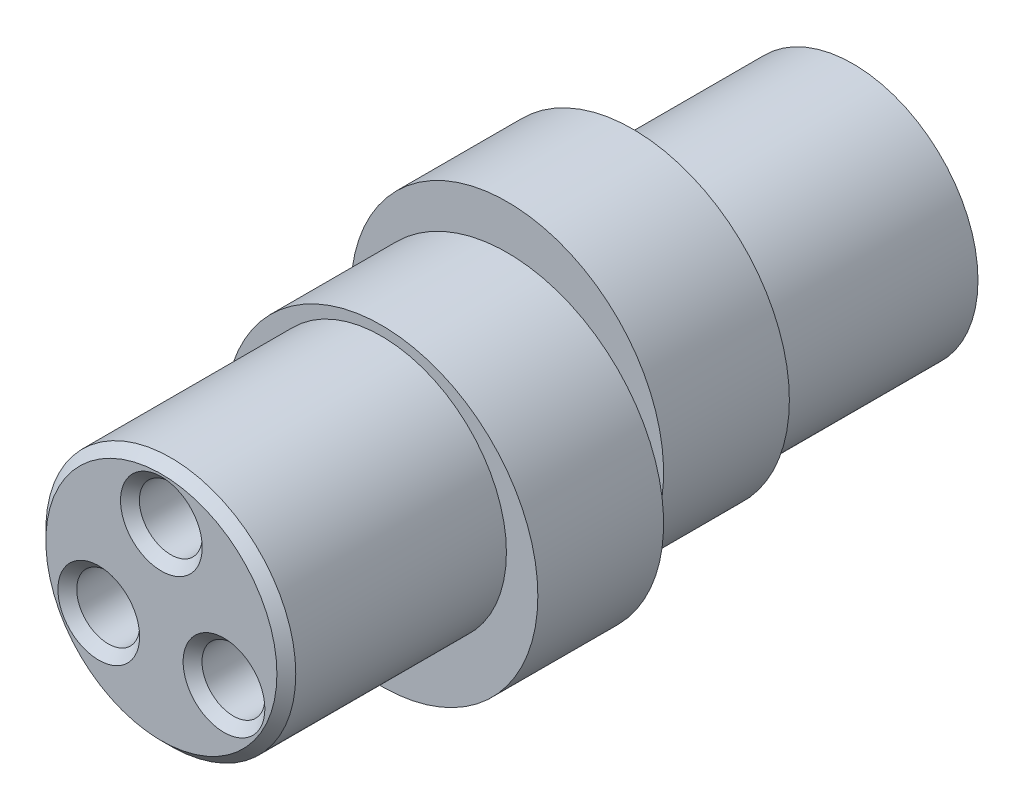
ISO-10303-21;
HEADER;
FILE_DESCRIPTION(('STEP AP214'),'2;1');
FILE_NAME('part.step','',(''),(''),'','','');
FILE_SCHEMA(('AUTOMOTIVE_DESIGN { 1 0 10303 214 1 1 1 1 }'));
ENDSEC;
DATA;
#1=APPLICATION_CONTEXT('core data for automotive mechanical design processes');
#2=APPLICATION_PROTOCOL_DEFINITION('international standard','automotive_design',2000,#1);
#3=PRODUCT_CONTEXT('',#1,'mechanical');
#4=PRODUCT('Part','Part','',(#3));
#5=PRODUCT_RELATED_PRODUCT_CATEGORY('part','',(#4));
#6=PRODUCT_DEFINITION_FORMATION('','',#4);
#7=PRODUCT_DEFINITION_CONTEXT('part definition',#1,'design');
#8=PRODUCT_DEFINITION('design','',#6,#7);
#9=PRODUCT_DEFINITION_SHAPE('','',#8);
#10=(LENGTH_UNIT() NAMED_UNIT(*) SI_UNIT(.MILLI.,.METRE.));
#11=(NAMED_UNIT(*) PLANE_ANGLE_UNIT() SI_UNIT($,.RADIAN.));
#12=(NAMED_UNIT(*) SI_UNIT($,.STERADIAN.) SOLID_ANGLE_UNIT());
#13=UNCERTAINTY_MEASURE_WITH_UNIT(LENGTH_MEASURE(1.E-05),#10,'distance_accuracy_value','');
#14=(GEOMETRIC_REPRESENTATION_CONTEXT(3) GLOBAL_UNCERTAINTY_ASSIGNED_CONTEXT((#13)) GLOBAL_UNIT_ASSIGNED_CONTEXT((#10,
#11,#12)) REPRESENTATION_CONTEXT('',''));
#15=CARTESIAN_POINT('',(0.,0.,0.));
#16=DIRECTION('',(0.,0.,1.));
#17=DIRECTION('',(1.,0.,0.));
#18=AXIS2_PLACEMENT_3D('',#15,#16,#17);
#19=CARTESIAN_POINT('',(0.,0.7,4.));
#20=DIRECTION('',(0.,0.,-1.));
#21=DIRECTION('',(-1.,0.,0.));
#22=AXIS2_PLACEMENT_3D('',#19,#20,#21);
#23=CYLINDRICAL_SURFACE('',#22,4.975);
#24=CARTESIAN_POINT('',(0.,0.7,4.));
#25=DIRECTION('',(0.,0.,1.));
#26=DIRECTION('',(1.,0.,0.));
#27=AXIS2_PLACEMENT_3D('',#24,#25,#26);
#28=CIRCLE('',#27,4.975);
#29=CARTESIAN_POINT('',(-4.92550758805628,0.,4.));
#30=VERTEX_POINT('',#29);
#31=CARTESIAN_POINT('',(4.92550758805628,0.,4.));
#32=VERTEX_POINT('',#31);
#33=EDGE_CURVE('E70',#30,#32,#28,.T.);
#34=ORIENTED_EDGE('',*,*,#33,.F.);
#35=EDGE_CURVE('E72',#32,#30,#28,.T.);
#36=ORIENTED_EDGE('',*,*,#35,.F.);
#37=EDGE_LOOP('',(#34,#36));
#38=FACE_BOUND('',#37,.T.);
#39=CARTESIAN_POINT('',(0.,0.7,0.));
#40=DIRECTION('',(0.,0.,1.));
#41=DIRECTION('',(1.,0.,0.));
#42=AXIS2_PLACEMENT_3D('',#39,#40,#41);
#43=CIRCLE('',#42,4.975);
#44=CARTESIAN_POINT('',(4.975,0.7,0.));
#45=VERTEX_POINT('',#44);
#46=EDGE_CURVE('E81',#45,#45,#43,.T.);
#47=ORIENTED_EDGE('',*,*,#46,.T.);
#48=EDGE_LOOP('',(#47));
#49=FACE_BOUND('',#48,.T.);
#50=ADVANCED_FACE('F49',(#38,#49),#23,.T.);
#51=CARTESIAN_POINT('',(0.,0.,4.));
#52=DIRECTION('',(0.,0.,1.));
#53=DIRECTION('',(1.,0.,0.));
#54=AXIS2_PLACEMENT_3D('',#51,#52,#53);
#55=PLANE('',#54);
#56=CARTESIAN_POINT('',(0.,-0.7,4.));
#57=DIRECTION('',(0.,0.,1.));
#58=DIRECTION('',(1.,0.,0.));
#59=AXIS2_PLACEMENT_3D('',#56,#57,#58);
#60=CIRCLE('',#59,4.975);
#61=EDGE_CURVE('E65',#32,#30,#60,.T.);
#62=ORIENTED_EDGE('',*,*,#61,.F.);
#63=ORIENTED_EDGE('',*,*,#35,.T.);
#64=EDGE_LOOP('',(#62,#63));
#65=FACE_BOUND('',#64,.T.);
#66=ADVANCED_FACE('F79',(#65),#55,.T.);
#67=CARTESIAN_POINT('',(0.,0.,0.));
#68=DIRECTION('',(0.,0.,1.));
#69=DIRECTION('',(1.,0.,0.));
#70=AXIS2_PLACEMENT_3D('',#67,#68,#69);
#71=PLANE('',#70);
#72=CARTESIAN_POINT('',(0.,0.,0.));
#73=DIRECTION('',(0.,0.,1.));
#74=DIRECTION('',(1.,0.,0.));
#75=AXIS2_PLACEMENT_3D('',#72,#73,#74);
#76=CIRCLE('',#75,3.975);
#77=CARTESIAN_POINT('',(3.975,0.,0.));
#78=VERTEX_POINT('',#77);
#79=EDGE_CURVE('E77',#78,#78,#76,.F.);
#80=ORIENTED_EDGE('',*,*,#79,.F.);
#81=EDGE_LOOP('',(#80));
#82=FACE_BOUND('',#81,.T.);
#83=ORIENTED_EDGE('',*,*,#46,.F.);
#84=EDGE_LOOP('',(#83));
#85=FACE_BOUND('',#84,.T.);
#86=ADVANCED_FACE('F152',(#82,#85),#71,.F.);
#87=CARTESIAN_POINT('',(0.,-0.7,4.));
#88=DIRECTION('',(0.,0.,1.));
#89=DIRECTION('',(1.,0.,0.));
#90=AXIS2_PLACEMENT_3D('',#87,#88,#89);
#91=PLANE('',#90);
#92=EDGE_CURVE('E82',#30,#32,#60,.T.);
#93=ORIENTED_EDGE('',*,*,#92,.F.);
#94=ORIENTED_EDGE('',*,*,#33,.T.);
#95=EDGE_LOOP('',(#93,#94));
#96=FACE_BOUND('',#95,.T.);
#97=ADVANCED_FACE('F83',(#96),#91,.F.);
#98=CARTESIAN_POINT('',(0.,-0.7,8.));
#99=DIRECTION('',(0.,0.,-1.));
#100=DIRECTION('',(-1.,0.,0.));
#101=AXIS2_PLACEMENT_3D('',#98,#99,#100);
#102=CYLINDRICAL_SURFACE('',#101,4.975);
#103=CARTESIAN_POINT('',(0.,-0.7,8.));
#104=DIRECTION('',(0.,0.,1.));
#105=DIRECTION('',(1.,0.,0.));
#106=AXIS2_PLACEMENT_3D('',#103,#104,#105);
#107=CIRCLE('',#106,4.975);
#108=CARTESIAN_POINT('',(4.975,-0.7,8.));
#109=VERTEX_POINT('',#108);
#110=EDGE_CURVE('E90',#109,#109,#107,.T.);
#111=ORIENTED_EDGE('',*,*,#110,.F.);
#112=EDGE_LOOP('',(#111));
#113=FACE_BOUND('',#112,.T.);
#114=ORIENTED_EDGE('',*,*,#61,.T.);
#115=ORIENTED_EDGE('',*,*,#92,.T.);
#116=EDGE_LOOP('',(#114,#115));
#117=FACE_BOUND('',#116,.T.);
#118=ADVANCED_FACE('F88',(#113,#117),#102,.T.);
#119=CARTESIAN_POINT('',(0.,-0.7,8.));
#120=DIRECTION('',(0.,0.,1.));
#121=DIRECTION('',(1.,0.,0.));
#122=AXIS2_PLACEMENT_3D('',#119,#120,#121);
#123=PLANE('',#122);
#124=CARTESIAN_POINT('',(0.,0.,8.));
#125=DIRECTION('',(0.,0.,1.));
#126=DIRECTION('',(1.,0.,0.));
#127=AXIS2_PLACEMENT_3D('',#124,#125,#126);
#128=CIRCLE('',#127,3.975);
#129=CARTESIAN_POINT('',(3.975,0.,8.));
#130=VERTEX_POINT('',#129);
#131=EDGE_CURVE('E86',#130,#130,#128,.F.);
#132=ORIENTED_EDGE('',*,*,#131,.T.);
#133=EDGE_LOOP('',(#132));
#134=FACE_BOUND('',#133,.T.);
#135=ORIENTED_EDGE('',*,*,#110,.T.);
#136=EDGE_LOOP('',(#135));
#137=FACE_BOUND('',#136,.T.);
#138=ADVANCED_FACE('F182',(#134,#137),#123,.T.);
#139=CARTESIAN_POINT('',(0.,0.,15.));
#140=DIRECTION('',(0.,0.,1.));
#141=DIRECTION('',(1.,0.,0.));
#142=AXIS2_PLACEMENT_3D('',#139,#140,#141);
#143=PLANE('',#142);
#144=CARTESIAN_POINT('',(0.,0.,15.));
#145=DIRECTION('',(0.,0.,1.));
#146=DIRECTION('',(1.,0.,0.));
#147=AXIS2_PLACEMENT_3D('',#144,#145,#146);
#148=CIRCLE('',#147,3.675);
#149=CARTESIAN_POINT('',(3.675,0.,15.));
#150=VERTEX_POINT('',#149);
#151=EDGE_CURVE('E115',#150,#150,#148,.T.);
#152=ORIENTED_EDGE('',*,*,#151,.T.);
#153=EDGE_LOOP('',(#152));
#154=FACE_BOUND('',#153,.T.);
#155=CARTESIAN_POINT('',(1.9918584287043,-1.14999999999994,15.));
#156=DIRECTION('',(0.,0.,1.));
#157=DIRECTION('',(1.,0.,0.));
#158=AXIS2_PLACEMENT_3D('',#155,#156,#157);
#159=CIRCLE('',#158,1.3);
#160=CARTESIAN_POINT('',(3.2918584287043,-1.14999999999994,15.));
#161=VERTEX_POINT('',#160);
#162=EDGE_CURVE('E111',#161,#161,#159,.F.);
#163=ORIENTED_EDGE('',*,*,#162,.T.);
#164=EDGE_LOOP('',(#163));
#165=FACE_BOUND('',#164,.T.);
#166=CARTESIAN_POINT('',(-1.99185842870411,-1.15000000000006,15.));
#167=DIRECTION('',(0.,0.,1.));
#168=DIRECTION('',(1.,0.,0.));
#169=AXIS2_PLACEMENT_3D('',#166,#167,#168);
#170=CIRCLE('',#169,1.3);
#171=CARTESIAN_POINT('',(-0.691858428704114,-1.15000000000006,15.));
#172=VERTEX_POINT('',#171);
#173=EDGE_CURVE('E107',#172,#172,#170,.F.);
#174=ORIENTED_EDGE('',*,*,#173,.T.);
#175=EDGE_LOOP('',(#174));
#176=FACE_BOUND('',#175,.T.);
#177=CARTESIAN_POINT('',(0.,2.3,15.));
#178=DIRECTION('',(0.,0.,1.));
#179=DIRECTION('',(1.,0.,0.));
#180=AXIS2_PLACEMENT_3D('',#177,#178,#179);
#181=CIRCLE('',#180,1.3);
#182=CARTESIAN_POINT('',(1.3,2.3,15.));
#183=VERTEX_POINT('',#182);
#184=EDGE_CURVE('E103',#183,#183,#181,.F.);
#185=ORIENTED_EDGE('',*,*,#184,.T.);
#186=EDGE_LOOP('',(#185));
#187=FACE_BOUND('',#186,.T.);
#188=ADVANCED_FACE('F178',(#154,#165,#176,#187),#143,.T.);
#189=CARTESIAN_POINT('',(0.,0.,15.));
#190=DIRECTION('',(0.,0.,-1.));
#191=DIRECTION('',(-1.,0.,0.));
#192=AXIS2_PLACEMENT_3D('',#189,#190,#191);
#193=CYLINDRICAL_SURFACE('',#192,3.975);
#194=CARTESIAN_POINT('',(0.,0.,14.7));
#195=DIRECTION('',(0.,0.,1.));
#196=DIRECTION('',(1.,0.,0.));
#197=AXIS2_PLACEMENT_3D('',#194,#195,#196);
#198=CIRCLE('',#197,3.975);
#199=CARTESIAN_POINT('',(3.975,0.,14.7));
#200=VERTEX_POINT('',#199);
#201=EDGE_CURVE('E119',#200,#200,#198,.F.);
#202=ORIENTED_EDGE('',*,*,#201,.T.);
#203=EDGE_LOOP('',(#202));
#204=FACE_BOUND('',#203,.T.);
#205=ORIENTED_EDGE('',*,*,#131,.F.);
#206=EDGE_LOOP('',(#205));
#207=FACE_BOUND('',#206,.T.);
#208=ADVANCED_FACE('F181',(#204,#207),#193,.T.);
#209=CARTESIAN_POINT('',(0.,0.,-7.));
#210=DIRECTION('',(0.,0.,1.));
#211=DIRECTION('',(1.,0.,0.));
#212=AXIS2_PLACEMENT_3D('',#209,#210,#211);
#213=CIRCLE('',#212,3.975);
#214=CARTESIAN_POINT('',(3.975,0.,-7.));
#215=VERTEX_POINT('',#214);
#216=EDGE_CURVE('E102',#215,#215,#213,.T.);
#217=ORIENTED_EDGE('',*,*,#216,.T.);
#218=EDGE_LOOP('',(#217));
#219=FACE_BOUND('',#218,.T.);
#220=ORIENTED_EDGE('',*,*,#79,.T.);
#221=EDGE_LOOP('',(#220));
#222=FACE_BOUND('',#221,.T.);
#223=ADVANCED_FACE('F212',(#219,#222),#193,.T.);
#224=CARTESIAN_POINT('',(0.,0.,-7.));
#225=DIRECTION('',(0.,0.,1.));
#226=DIRECTION('',(1.,0.,0.));
#227=AXIS2_PLACEMENT_3D('',#224,#225,#226);
#228=PLANE('',#227);
#229=CARTESIAN_POINT('',(0.,2.3,-7.));
#230=DIRECTION('',(0.,0.,1.));
#231=DIRECTION('',(1.,0.,0.));
#232=AXIS2_PLACEMENT_3D('',#229,#230,#231);
#233=CIRCLE('',#232,1.);
#234=CARTESIAN_POINT('',(1.,2.3,-7.));
#235=VERTEX_POINT('',#234);
#236=EDGE_CURVE('E193',#235,#235,#233,.T.);
#237=ORIENTED_EDGE('',*,*,#236,.T.);
#238=EDGE_LOOP('',(#237));
#239=FACE_BOUND('',#238,.T.);
#240=CARTESIAN_POINT('',(-1.99185842870411,-1.15000000000006,-7.));
#241=DIRECTION('',(0.,0.,1.));
#242=DIRECTION('',(1.,0.,0.));
#243=AXIS2_PLACEMENT_3D('',#240,#241,#242);
#244=CIRCLE('',#243,1.);
#245=CARTESIAN_POINT('',(-0.991858428704113,-1.15000000000006,-7.));
#246=VERTEX_POINT('',#245);
#247=EDGE_CURVE('E196',#246,#246,#244,.T.);
#248=ORIENTED_EDGE('',*,*,#247,.T.);
#249=EDGE_LOOP('',(#248));
#250=FACE_BOUND('',#249,.T.);
#251=CARTESIAN_POINT('',(1.9918584287043,-1.14999999999994,-7.));
#252=DIRECTION('',(0.,0.,1.));
#253=DIRECTION('',(1.,0.,0.));
#254=AXIS2_PLACEMENT_3D('',#251,#252,#253);
#255=CIRCLE('',#254,1.);
#256=CARTESIAN_POINT('',(2.9918584287043,-1.14999999999994,-7.));
#257=VERTEX_POINT('',#256);
#258=EDGE_CURVE('E203',#257,#257,#255,.T.);
#259=ORIENTED_EDGE('',*,*,#258,.T.);
#260=EDGE_LOOP('',(#259));
#261=FACE_BOUND('',#260,.T.);
#262=ORIENTED_EDGE('',*,*,#216,.F.);
#263=EDGE_LOOP('',(#262));
#264=FACE_BOUND('',#263,.T.);
#265=ADVANCED_FACE('F233',(#239,#250,#261,#264),#228,.F.);
#266=CARTESIAN_POINT('',(1.9918584287043,-1.14999999999994,-7.));
#267=DIRECTION('',(0.,0.,1.));
#268=DIRECTION('',(1.,0.,0.));
#269=AXIS2_PLACEMENT_3D('',#266,#267,#268);
#270=CYLINDRICAL_SURFACE('',#269,1.);
#271=CARTESIAN_POINT('',(1.9918584287043,-1.14999999999994,14.7));
#272=DIRECTION('',(0.,0.,1.));
#273=DIRECTION('',(1.,0.,0.));
#274=AXIS2_PLACEMENT_3D('',#271,#272,#273);
#275=CIRCLE('',#274,1.);
#276=CARTESIAN_POINT('',(2.9918584287043,-1.14999999999994,14.7));
#277=VERTEX_POINT('',#276);
#278=EDGE_CURVE('E123',#277,#277,#275,.T.);
#279=ORIENTED_EDGE('',*,*,#278,.T.);
#280=EDGE_LOOP('',(#279));
#281=FACE_BOUND('',#280,.T.);
#282=ORIENTED_EDGE('',*,*,#258,.F.);
#283=EDGE_LOOP('',(#282));
#284=FACE_BOUND('',#283,.T.);
#285=ADVANCED_FACE('F236',(#281,#284),#270,.F.);
#286=CARTESIAN_POINT('',(-1.99185842870411,-1.15000000000006,-7.));
#287=DIRECTION('',(0.,0.,1.));
#288=DIRECTION('',(1.,0.,0.));
#289=AXIS2_PLACEMENT_3D('',#286,#287,#288);
#290=CYLINDRICAL_SURFACE('',#289,1.);
#291=CARTESIAN_POINT('',(-1.99185842870411,-1.15000000000006,14.7));
#292=DIRECTION('',(0.,0.,1.));
#293=DIRECTION('',(1.,0.,0.));
#294=AXIS2_PLACEMENT_3D('',#291,#292,#293);
#295=CIRCLE('',#294,1.);
#296=CARTESIAN_POINT('',(-0.991858428704113,-1.15000000000006,14.7));
#297=VERTEX_POINT('',#296);
#298=EDGE_CURVE('E59',#297,#297,#295,.T.);
#299=ORIENTED_EDGE('',*,*,#298,.T.);
#300=EDGE_LOOP('',(#299));
#301=FACE_BOUND('',#300,.T.);
#302=ORIENTED_EDGE('',*,*,#247,.F.);
#303=EDGE_LOOP('',(#302));
#304=FACE_BOUND('',#303,.T.);
#305=ADVANCED_FACE('F130',(#301,#304),#290,.F.);
#306=CARTESIAN_POINT('',(0.,2.3,-7.));
#307=DIRECTION('',(0.,0.,1.));
#308=DIRECTION('',(1.,0.,0.));
#309=AXIS2_PLACEMENT_3D('',#306,#307,#308);
#310=CYLINDRICAL_SURFACE('',#309,1.);
#311=CARTESIAN_POINT('',(0.,2.3,14.7));
#312=DIRECTION('',(0.,0.,1.));
#313=DIRECTION('',(1.,0.,0.));
#314=AXIS2_PLACEMENT_3D('',#311,#312,#313);
#315=CIRCLE('',#314,1.);
#316=CARTESIAN_POINT('',(1.,2.3,14.7));
#317=VERTEX_POINT('',#316);
#318=EDGE_CURVE('E11',#317,#317,#315,.T.);
#319=ORIENTED_EDGE('',*,*,#318,.T.);
#320=EDGE_LOOP('',(#319));
#321=FACE_BOUND('',#320,.T.);
#322=ORIENTED_EDGE('',*,*,#236,.F.);
#323=EDGE_LOOP('',(#322));
#324=FACE_BOUND('',#323,.T.);
#325=ADVANCED_FACE('F161',(#321,#324),#310,.F.);
#326=CARTESIAN_POINT('',(0.,0.,15.));
#327=DIRECTION('',(0.,0.,-1.));
#328=DIRECTION('',(-1.,0.,0.));
#329=AXIS2_PLACEMENT_3D('',#326,#327,#328);
#330=CONICAL_SURFACE('',#329,3.675,0.785398163397453);
#331=ORIENTED_EDGE('',*,*,#201,.F.);
#332=EDGE_LOOP('',(#331));
#333=FACE_BOUND('',#332,.T.);
#334=ORIENTED_EDGE('',*,*,#151,.F.);
#335=EDGE_LOOP('',(#334));
#336=FACE_BOUND('',#335,.T.);
#337=ADVANCED_FACE('F142',(#333,#336),#330,.T.);
#338=CARTESIAN_POINT('',(1.9918584287043,-1.14999999999994,14.7));
#339=DIRECTION('',(0.,0.,1.));
#340=DIRECTION('',(1.,0.,0.));
#341=AXIS2_PLACEMENT_3D('',#338,#339,#340);
#342=CONICAL_SURFACE('',#341,1.,0.785398163397455);
#343=ORIENTED_EDGE('',*,*,#162,.F.);
#344=EDGE_LOOP('',(#343));
#345=FACE_BOUND('',#344,.T.);
#346=ORIENTED_EDGE('',*,*,#278,.F.);
#347=EDGE_LOOP('',(#346));
#348=FACE_BOUND('',#347,.T.);
#349=ADVANCED_FACE('F135',(#345,#348),#342,.F.);
#350=CARTESIAN_POINT('',(-1.99185842870411,-1.15000000000006,14.7));
#351=DIRECTION('',(0.,0.,1.));
#352=DIRECTION('',(1.,0.,0.));
#353=AXIS2_PLACEMENT_3D('',#350,#351,#352);
#354=CONICAL_SURFACE('',#353,1.,0.785398163397455);
#355=ORIENTED_EDGE('',*,*,#173,.F.);
#356=EDGE_LOOP('',(#355));
#357=FACE_BOUND('',#356,.T.);
#358=ORIENTED_EDGE('',*,*,#298,.F.);
#359=EDGE_LOOP('',(#358));
#360=FACE_BOUND('',#359,.T.);
#361=ADVANCED_FACE('F133',(#357,#360),#354,.F.);
#362=CARTESIAN_POINT('',(0.,2.3,14.7));
#363=DIRECTION('',(0.,0.,1.));
#364=DIRECTION('',(1.,0.,0.));
#365=AXIS2_PLACEMENT_3D('',#362,#363,#364);
#366=CONICAL_SURFACE('',#365,1.,0.785398163397455);
#367=ORIENTED_EDGE('',*,*,#184,.F.);
#368=EDGE_LOOP('',(#367));
#369=FACE_BOUND('',#368,.T.);
#370=ORIENTED_EDGE('',*,*,#318,.F.);
#371=EDGE_LOOP('',(#370));
#372=FACE_BOUND('',#371,.T.);
#373=ADVANCED_FACE('F52',(#369,#372),#366,.F.);
#374=CLOSED_SHELL('',(#50,#66,#86,#97,#118,#138,#188,#208,#223,#265,#285,#305,#325,#337,#349,
#361,#373));
#375=MANIFOLD_SOLID_BREP('B2',#374);
#376=ADVANCED_BREP_SHAPE_REPRESENTATION('',(#18,#375),#14);
#377=SHAPE_DEFINITION_REPRESENTATION(#9,#376);
ENDSEC;
END-ISO-10303-21;
